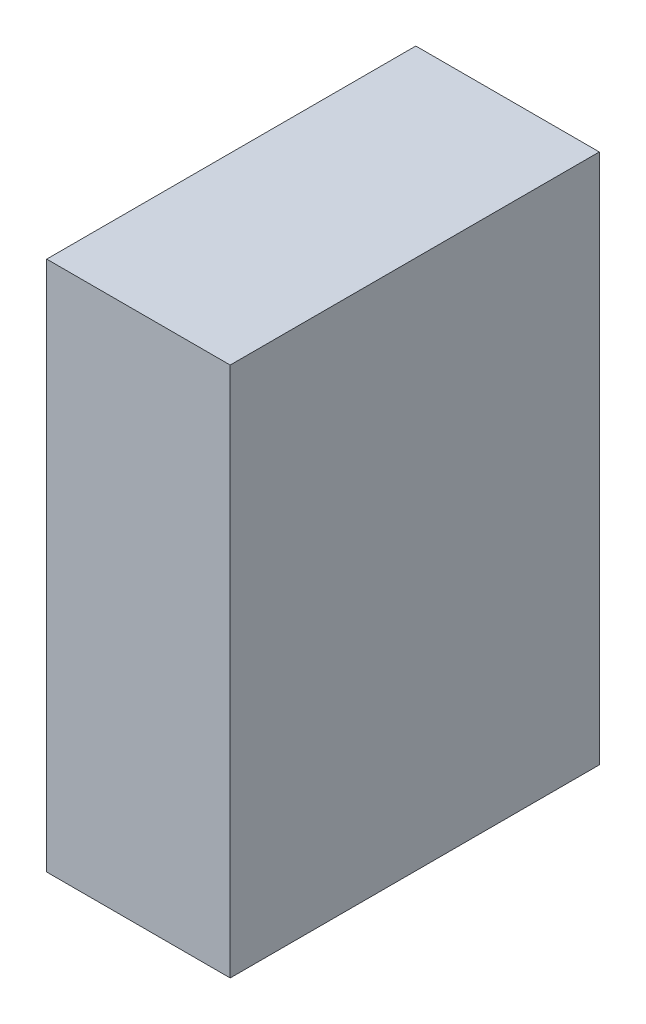
ISO-10303-21;
HEADER;
FILE_DESCRIPTION(('STEP AP214'),'2;1');
FILE_NAME('part.step','',(''),(''),'','','');
FILE_SCHEMA(('AUTOMOTIVE_DESIGN { 1 0 10303 214 1 1 1 1 }'));
ENDSEC;
DATA;
#1=APPLICATION_CONTEXT('core data for automotive mechanical design processes');
#2=APPLICATION_PROTOCOL_DEFINITION('international standard','automotive_design',2000,#1);
#3=PRODUCT_CONTEXT('',#1,'mechanical');
#4=PRODUCT('Part','Part','',(#3));
#5=PRODUCT_RELATED_PRODUCT_CATEGORY('part','',(#4));
#6=PRODUCT_DEFINITION_FORMATION('','',#4);
#7=PRODUCT_DEFINITION_CONTEXT('part definition',#1,'design');
#8=PRODUCT_DEFINITION('design','',#6,#7);
#9=PRODUCT_DEFINITION_SHAPE('','',#8);
#10=(LENGTH_UNIT() NAMED_UNIT(*) SI_UNIT(.MILLI.,.METRE.));
#11=(NAMED_UNIT(*) PLANE_ANGLE_UNIT() SI_UNIT($,.RADIAN.));
#12=(NAMED_UNIT(*) SI_UNIT($,.STERADIAN.) SOLID_ANGLE_UNIT());
#13=UNCERTAINTY_MEASURE_WITH_UNIT(LENGTH_MEASURE(1.E-05),#10,'distance_accuracy_value','');
#14=(GEOMETRIC_REPRESENTATION_CONTEXT(3) GLOBAL_UNCERTAINTY_ASSIGNED_CONTEXT((#13)) GLOBAL_UNIT_ASSIGNED_CONTEXT((#10,
#11,#12)) REPRESENTATION_CONTEXT('',''));
#15=CARTESIAN_POINT('',(0.,0.,0.));
#16=DIRECTION('',(0.,0.,1.));
#17=DIRECTION('',(1.,0.,0.));
#18=AXIS2_PLACEMENT_3D('',#15,#16,#17);
#19=CARTESIAN_POINT('',(-6.35874658367949,-61.5,-36.98));
#20=DIRECTION('',(-1.,0.,0.));
#21=DIRECTION('',(0.,-1.,0.));
#22=AXIS2_PLACEMENT_3D('',#19,#20,#21);
#23=PLANE('',#22);
#24=DIRECTION('',(0.,0.,1.));
#25=VECTOR('',#24,1.);
#26=CARTESIAN_POINT('',(-6.35874658367949,-36.5,-36.99));
#27=LINE('',#26,#25);
#28=CARTESIAN_POINT('',(-6.35874658367949,-36.5,-54.3725396741245));
#29=VERTEX_POINT('',#28);
#30=CARTESIAN_POINT('',(-6.35874658367949,-36.5,-36.99));
#31=VERTEX_POINT('',#30);
#32=EDGE_CURVE('E36',#29,#31,#27,.T.);
#33=ORIENTED_EDGE('',*,*,#32,.T.);
#34=DIRECTION('',(0.,-1.,0.));
#35=VECTOR('',#34,1.);
#36=CARTESIAN_POINT('',(-6.35874658367949,-36.5,-36.99));
#37=LINE('',#36,#35);
#38=CARTESIAN_POINT('',(-6.35874658367949,-61.5,-36.99));
#39=VERTEX_POINT('',#38);
#40=EDGE_CURVE('E11',#31,#39,#37,.T.);
#41=ORIENTED_EDGE('',*,*,#40,.T.);
#42=DIRECTION('',(0.,0.,-1.));
#43=VECTOR('',#42,1.);
#44=CARTESIAN_POINT('',(-6.35874658367949,-61.5,-36.99));
#45=LINE('',#44,#43);
#46=CARTESIAN_POINT('',(-6.35874658367949,-61.5,-54.3725396741245));
#47=VERTEX_POINT('',#46);
#48=EDGE_CURVE('E41',#39,#47,#45,.T.);
#49=ORIENTED_EDGE('',*,*,#48,.T.);
#50=DIRECTION('',(0.,1.,0.));
#51=VECTOR('',#50,1.);
#52=CARTESIAN_POINT('',(-6.35874658367949,-61.5,-54.3725396741245));
#53=LINE('',#52,#51);
#54=EDGE_CURVE('E103',#47,#29,#53,.T.);
#55=ORIENTED_EDGE('',*,*,#54,.T.);
#56=EDGE_LOOP('',(#33,#41,#49,#55));
#57=FACE_BOUND('',#56,.T.);
#58=ADVANCED_FACE('F33',(#57),#23,.F.);
#59=CARTESIAN_POINT('',(-15.,-61.5,-54.3725396741245));
#60=DIRECTION('',(0.,0.,-1.));
#61=DIRECTION('',(-1.,0.,0.));
#62=AXIS2_PLACEMENT_3D('',#59,#60,#61);
#63=PLANE('',#62);
#64=ORIENTED_EDGE('',*,*,#54,.F.);
#65=DIRECTION('',(1.,0.,0.));
#66=VECTOR('',#65,1.);
#67=CARTESIAN_POINT('',(-15.,-61.5,-54.3725396741245));
#68=LINE('',#67,#66);
#69=CARTESIAN_POINT('',(-15.,-61.5,-54.3725396741245));
#70=VERTEX_POINT('',#69);
#71=EDGE_CURVE('E100',#70,#47,#68,.T.);
#72=ORIENTED_EDGE('',*,*,#71,.F.);
#73=DIRECTION('',(0.,1.,0.));
#74=VECTOR('',#73,1.);
#75=CARTESIAN_POINT('',(-15.,-61.5,-54.3725396741245));
#76=LINE('',#75,#74);
#77=CARTESIAN_POINT('',(-15.,-36.5,-54.3725396741245));
#78=VERTEX_POINT('',#77);
#79=EDGE_CURVE('E80',#70,#78,#76,.T.);
#80=ORIENTED_EDGE('',*,*,#79,.T.);
#81=DIRECTION('',(1.,0.,0.));
#82=VECTOR('',#81,1.);
#83=CARTESIAN_POINT('',(-15.,-36.5,-54.3725396741245));
#84=LINE('',#83,#82);
#85=EDGE_CURVE('E94',#78,#29,#84,.T.);
#86=ORIENTED_EDGE('',*,*,#85,.T.);
#87=EDGE_LOOP('',(#64,#72,#80,#86));
#88=FACE_BOUND('',#87,.T.);
#89=ADVANCED_FACE('F106',(#88),#63,.T.);
#90=CARTESIAN_POINT('',(-15.,-61.5,-36.99));
#91=DIRECTION('',(0.,-1.,0.));
#92=DIRECTION('',(0.,0.,-1.));
#93=AXIS2_PLACEMENT_3D('',#90,#91,#92);
#94=PLANE('',#93);
#95=ORIENTED_EDGE('',*,*,#48,.F.);
#96=DIRECTION('',(1.,0.,0.));
#97=VECTOR('',#96,1.);
#98=CARTESIAN_POINT('',(-15.,-61.5,-36.99));
#99=LINE('',#98,#97);
#100=CARTESIAN_POINT('',(-15.,-61.5,-36.99));
#101=VERTEX_POINT('',#100);
#102=EDGE_CURVE('E79',#101,#39,#99,.T.);
#103=ORIENTED_EDGE('',*,*,#102,.F.);
#104=DIRECTION('',(0.,0.,-1.));
#105=VECTOR('',#104,1.);
#106=CARTESIAN_POINT('',(-15.,-61.5,-36.99));
#107=LINE('',#106,#105);
#108=EDGE_CURVE('E90',#101,#70,#107,.T.);
#109=ORIENTED_EDGE('',*,*,#108,.T.);
#110=ORIENTED_EDGE('',*,*,#71,.T.);
#111=EDGE_LOOP('',(#95,#103,#109,#110));
#112=FACE_BOUND('',#111,.T.);
#113=ADVANCED_FACE('F107',(#112),#94,.T.);
#114=CARTESIAN_POINT('',(-15.,0.,0.));
#115=DIRECTION('',(1.,0.,0.));
#116=DIRECTION('',(0.,0.,-1.));
#117=AXIS2_PLACEMENT_3D('',#114,#115,#116);
#118=PLANE('',#117);
#119=DIRECTION('',(0.,0.,1.));
#120=VECTOR('',#119,1.);
#121=CARTESIAN_POINT('',(-15.,-36.5,-36.99));
#122=LINE('',#121,#120);
#123=CARTESIAN_POINT('',(-15.,-36.5,-36.99));
#124=VERTEX_POINT('',#123);
#125=EDGE_CURVE('E87',#78,#124,#122,.T.);
#126=ORIENTED_EDGE('',*,*,#125,.F.);
#127=ORIENTED_EDGE('',*,*,#79,.F.);
#128=ORIENTED_EDGE('',*,*,#108,.F.);
#129=DIRECTION('',(0.,-1.,0.));
#130=VECTOR('',#129,1.);
#131=CARTESIAN_POINT('',(-15.,-36.5,-36.99));
#132=LINE('',#131,#130);
#133=EDGE_CURVE('E75',#124,#101,#132,.T.);
#134=ORIENTED_EDGE('',*,*,#133,.F.);
#135=EDGE_LOOP('',(#126,#127,#128,#134));
#136=FACE_BOUND('',#135,.T.);
#137=ADVANCED_FACE('F85',(#136),#118,.F.);
#138=CARTESIAN_POINT('',(-15.,-36.5,-36.99));
#139=DIRECTION('',(0.,1.,0.));
#140=DIRECTION('',(0.,0.,1.));
#141=AXIS2_PLACEMENT_3D('',#138,#139,#140);
#142=PLANE('',#141);
#143=ORIENTED_EDGE('',*,*,#32,.F.);
#144=ORIENTED_EDGE('',*,*,#85,.F.);
#145=ORIENTED_EDGE('',*,*,#125,.T.);
#146=DIRECTION('',(1.,0.,0.));
#147=VECTOR('',#146,1.);
#148=CARTESIAN_POINT('',(-15.,-36.5,-36.99));
#149=LINE('',#148,#147);
#150=EDGE_CURVE('E72',#124,#31,#149,.T.);
#151=ORIENTED_EDGE('',*,*,#150,.T.);
#152=EDGE_LOOP('',(#143,#144,#145,#151));
#153=FACE_BOUND('',#152,.T.);
#154=ADVANCED_FACE('F92',(#153),#142,.T.);
#155=CARTESIAN_POINT('',(-15.,-36.5,-36.99));
#156=DIRECTION('',(0.,0.,1.));
#157=DIRECTION('',(0.,-1.,0.));
#158=AXIS2_PLACEMENT_3D('',#155,#156,#157);
#159=PLANE('',#158);
#160=ORIENTED_EDGE('',*,*,#40,.F.);
#161=ORIENTED_EDGE('',*,*,#150,.F.);
#162=ORIENTED_EDGE('',*,*,#133,.T.);
#163=ORIENTED_EDGE('',*,*,#102,.T.);
#164=EDGE_LOOP('',(#160,#161,#162,#163));
#165=FACE_BOUND('',#164,.T.);
#166=ADVANCED_FACE('F74',(#165),#159,.T.);
#167=CLOSED_SHELL('',(#58,#89,#113,#137,#154,#166));
#168=MANIFOLD_SOLID_BREP('B2',#167);
#169=ADVANCED_BREP_SHAPE_REPRESENTATION('',(#18,#168),#14);
#170=SHAPE_DEFINITION_REPRESENTATION(#9,#169);
ENDSEC;
END-ISO-10303-21;
